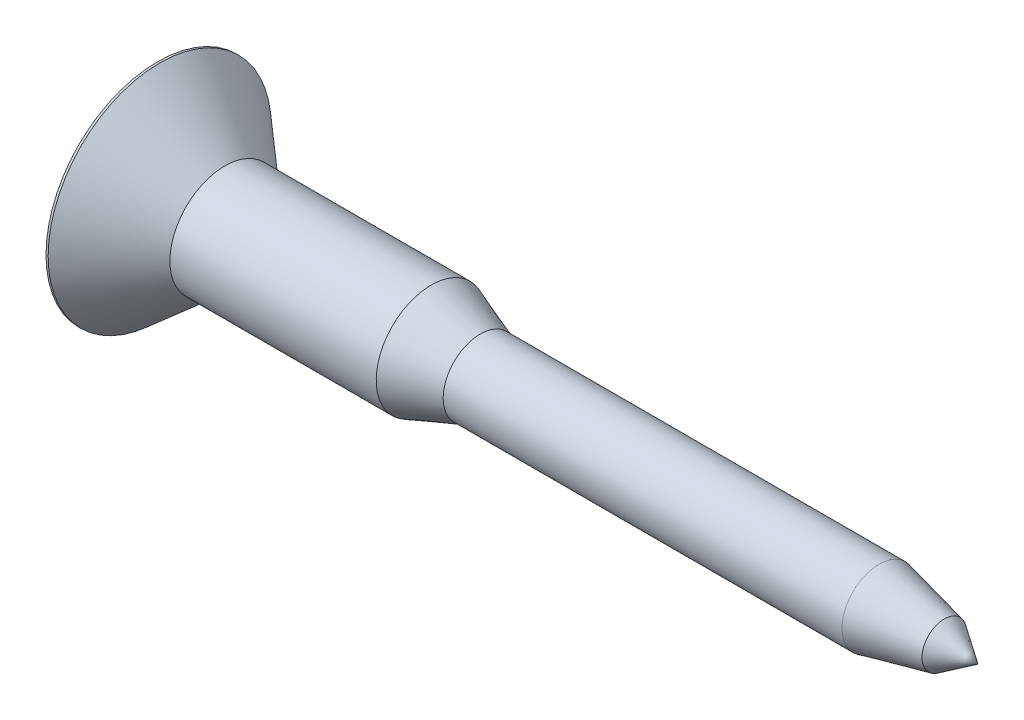
ISO-10303-21;
HEADER;
FILE_DESCRIPTION(('STEP AP214'),'2;1');
FILE_NAME('part.step','',(''),(''),'','','');
FILE_SCHEMA(('AUTOMOTIVE_DESIGN { 1 0 10303 214 1 1 1 1 }'));
ENDSEC;
DATA;
#1=APPLICATION_CONTEXT('core data for automotive mechanical design processes');
#2=APPLICATION_PROTOCOL_DEFINITION('international standard','automotive_design',2000,#1);
#3=PRODUCT_CONTEXT('',#1,'mechanical');
#4=PRODUCT('Part','Part','',(#3));
#5=PRODUCT_RELATED_PRODUCT_CATEGORY('part','',(#4));
#6=PRODUCT_DEFINITION_FORMATION('','',#4);
#7=PRODUCT_DEFINITION_CONTEXT('part definition',#1,'design');
#8=PRODUCT_DEFINITION('design','',#6,#7);
#9=PRODUCT_DEFINITION_SHAPE('','',#8);
#10=(LENGTH_UNIT() NAMED_UNIT(*) SI_UNIT(.MILLI.,.METRE.));
#11=(NAMED_UNIT(*) PLANE_ANGLE_UNIT() SI_UNIT($,.RADIAN.));
#12=(NAMED_UNIT(*) SI_UNIT($,.STERADIAN.) SOLID_ANGLE_UNIT());
#13=UNCERTAINTY_MEASURE_WITH_UNIT(LENGTH_MEASURE(1.E-05),#10,'distance_accuracy_value','');
#14=(GEOMETRIC_REPRESENTATION_CONTEXT(3) GLOBAL_UNCERTAINTY_ASSIGNED_CONTEXT((#13)) GLOBAL_UNIT_ASSIGNED_CONTEXT((#10,
#11,#12)) REPRESENTATION_CONTEXT('',''));
#15=CARTESIAN_POINT('',(0.,0.,0.));
#16=DIRECTION('',(0.,0.,1.));
#17=DIRECTION('',(1.,0.,0.));
#18=AXIS2_PLACEMENT_3D('',#15,#16,#17);
#19=CARTESIAN_POINT('',(-25.4,0.,0.));
#20=DIRECTION('',(1.,0.,0.));
#21=DIRECTION('',(0.,1.,0.));
#22=AXIS2_PLACEMENT_3D('',#19,#20,#21);
#23=PLANE('',#22);
#24=CARTESIAN_POINT('',(-25.4,0.,0.));
#25=DIRECTION('',(-1.,0.,0.));
#26=DIRECTION('',(0.,-1.,0.));
#27=AXIS2_PLACEMENT_3D('',#24,#25,#26);
#28=CIRCLE('',#27,6.9088);
#29=CARTESIAN_POINT('',(-25.4,-6.9088,0.));
#30=VERTEX_POINT('',#29);
#31=EDGE_CURVE('E346',#30,#30,#28,.T.);
#32=ORIENTED_EDGE('',*,*,#31,.T.);
#33=EDGE_LOOP('',(#32));
#34=FACE_BOUND('',#33,.T.);
#35=DIRECTION('',(0.,1.,0.));
#36=VECTOR('',#35,1.);
#37=CARTESIAN_POINT('',(-25.4,3.523488,-0.621792));
#38=LINE('',#37,#36);
#39=CARTESIAN_POINT('',(-25.4,1.64836786861186,-0.621792));
#40=VERTEX_POINT('',#39);
#41=CARTESIAN_POINT('',(-25.4,3.523488,-0.621792));
#42=VERTEX_POINT('',#41);
#43=EDGE_CURVE('E65',#40,#42,#38,.T.);
#44=ORIENTED_EDGE('',*,*,#43,.T.);
#45=DIRECTION('',(0.,0.,1.));
#46=VECTOR('',#45,1.);
#47=CARTESIAN_POINT('',(-25.4,3.523488,-0.621792));
#48=LINE('',#47,#46);
#49=CARTESIAN_POINT('',(-25.4,3.523488,0.621792));
#50=VERTEX_POINT('',#49);
#51=EDGE_CURVE('E761',#42,#50,#48,.T.);
#52=ORIENTED_EDGE('',*,*,#51,.T.);
#53=DIRECTION('',(0.,-1.,0.));
#54=VECTOR('',#53,1.);
#55=CARTESIAN_POINT('',(-25.4,3.523488,0.621792));
#56=LINE('',#55,#54);
#57=CARTESIAN_POINT('',(-25.4,1.64836786861186,0.621792));
#58=VERTEX_POINT('',#57);
#59=EDGE_CURVE('E765',#50,#58,#56,.T.);
#60=ORIENTED_EDGE('',*,*,#59,.T.);
#61=DIRECTION('',(0.,-0.916469532911304,0.400104480411474));
#62=VECTOR('',#61,1.);
#63=CARTESIAN_POINT('',(-25.4,0.933766564557356,0.933766564557357));
#64=LINE('',#63,#62);
#65=CARTESIAN_POINT('',(-25.4,0.933766564557356,0.933766564557357));
#66=VERTEX_POINT('',#65);
#67=EDGE_CURVE('E769',#58,#66,#64,.T.);
#68=ORIENTED_EDGE('',*,*,#67,.T.);
#69=DIRECTION('',(0.,-0.400104480411474,0.916469532911304));
#70=VECTOR('',#69,1.);
#71=CARTESIAN_POINT('',(-25.4,0.621792,1.64836786861186));
#72=LINE('',#71,#70);
#73=CARTESIAN_POINT('',(-25.4,0.621792,1.64836786861186));
#74=VERTEX_POINT('',#73);
#75=EDGE_CURVE('E773',#66,#74,#72,.T.);
#76=ORIENTED_EDGE('',*,*,#75,.T.);
#77=DIRECTION('',(0.,0.,1.));
#78=VECTOR('',#77,1.);
#79=CARTESIAN_POINT('',(-25.4,0.621792,1.64836786861186));
#80=LINE('',#79,#78);
#81=CARTESIAN_POINT('',(-25.4,0.621792,3.523488));
#82=VERTEX_POINT('',#81);
#83=EDGE_CURVE('E718',#74,#82,#80,.T.);
#84=ORIENTED_EDGE('',*,*,#83,.T.);
#85=DIRECTION('',(0.,-1.,0.));
#86=VECTOR('',#85,1.);
#87=CARTESIAN_POINT('',(-25.4,0.621792,3.523488));
#88=LINE('',#87,#86);
#89=CARTESIAN_POINT('',(-25.4,-0.621792,3.523488));
#90=VERTEX_POINT('',#89);
#91=EDGE_CURVE('E714',#82,#90,#88,.T.);
#92=ORIENTED_EDGE('',*,*,#91,.T.);
#93=DIRECTION('',(0.,0.,-1.));
#94=VECTOR('',#93,1.);
#95=CARTESIAN_POINT('',(-25.4,-0.621792,1.64836786861186));
#96=LINE('',#95,#94);
#97=CARTESIAN_POINT('',(-25.4,-0.621792,1.64836786861186));
#98=VERTEX_POINT('',#97);
#99=EDGE_CURVE('E780',#90,#98,#96,.T.);
#100=ORIENTED_EDGE('',*,*,#99,.T.);
#101=DIRECTION('',(0.,-0.400104480411474,-0.916469532911304));
#102=VECTOR('',#101,1.);
#103=CARTESIAN_POINT('',(-25.4,-0.621792,1.64836786861186));
#104=LINE('',#103,#102);
#105=CARTESIAN_POINT('',(-25.4,-0.933766564557356,0.933766564557357));
#106=VERTEX_POINT('',#105);
#107=EDGE_CURVE('E784',#98,#106,#104,.T.);
#108=ORIENTED_EDGE('',*,*,#107,.T.);
#109=DIRECTION('',(0.,-0.916469532911304,-0.400104480411474));
#110=VECTOR('',#109,1.);
#111=CARTESIAN_POINT('',(-25.4,-0.933766564557356,0.933766564557357));
#112=LINE('',#111,#110);
#113=CARTESIAN_POINT('',(-25.4,-1.64836786861186,0.621792));
#114=VERTEX_POINT('',#113);
#115=EDGE_CURVE('E788',#106,#114,#112,.T.);
#116=ORIENTED_EDGE('',*,*,#115,.T.);
#117=DIRECTION('',(0.,-1.,0.));
#118=VECTOR('',#117,1.);
#119=CARTESIAN_POINT('',(-25.4,-1.64836786861186,0.621792));
#120=LINE('',#119,#118);
#121=CARTESIAN_POINT('',(-25.4,-3.523488,0.621792));
#122=VERTEX_POINT('',#121);
#123=EDGE_CURVE('E792',#114,#122,#120,.T.);
#124=ORIENTED_EDGE('',*,*,#123,.T.);
#125=DIRECTION('',(0.,0.,-1.));
#126=VECTOR('',#125,1.);
#127=CARTESIAN_POINT('',(-25.4,-3.523488,-0.621792));
#128=LINE('',#127,#126);
#129=CARTESIAN_POINT('',(-25.4,-3.523488,-0.621792));
#130=VERTEX_POINT('',#129);
#131=EDGE_CURVE('E796',#122,#130,#128,.T.);
#132=ORIENTED_EDGE('',*,*,#131,.T.);
#133=DIRECTION('',(0.,1.,0.));
#134=VECTOR('',#133,1.);
#135=CARTESIAN_POINT('',(-25.4,-1.64836786861186,-0.621792));
#136=LINE('',#135,#134);
#137=CARTESIAN_POINT('',(-25.4,-1.64836786861186,-0.621792));
#138=VERTEX_POINT('',#137);
#139=EDGE_CURVE('E800',#130,#138,#136,.T.);
#140=ORIENTED_EDGE('',*,*,#139,.T.);
#141=DIRECTION('',(0.,0.916469532911304,-0.400104480411474));
#142=VECTOR('',#141,1.);
#143=CARTESIAN_POINT('',(-25.4,-0.933766564557356,-0.933766564557357));
#144=LINE('',#143,#142);
#145=CARTESIAN_POINT('',(-25.4,-0.933766564557356,-0.933766564557357));
#146=VERTEX_POINT('',#145);
#147=EDGE_CURVE('E804',#138,#146,#144,.T.);
#148=ORIENTED_EDGE('',*,*,#147,.T.);
#149=DIRECTION('',(0.,0.400104480411474,-0.916469532911304));
#150=VECTOR('',#149,1.);
#151=CARTESIAN_POINT('',(-25.4,-0.621792,-1.64836786861186));
#152=LINE('',#151,#150);
#153=CARTESIAN_POINT('',(-25.4,-0.621792,-1.64836786861186));
#154=VERTEX_POINT('',#153);
#155=EDGE_CURVE('E808',#146,#154,#152,.T.);
#156=ORIENTED_EDGE('',*,*,#155,.T.);
#157=DIRECTION('',(0.,0.,-1.));
#158=VECTOR('',#157,1.);
#159=CARTESIAN_POINT('',(-25.4,-0.621792,-3.523488));
#160=LINE('',#159,#158);
#161=CARTESIAN_POINT('',(-25.4,-0.621792,-3.523488));
#162=VERTEX_POINT('',#161);
#163=EDGE_CURVE('E812',#154,#162,#160,.T.);
#164=ORIENTED_EDGE('',*,*,#163,.T.);
#165=DIRECTION('',(0.,1.,0.));
#166=VECTOR('',#165,1.);
#167=CARTESIAN_POINT('',(-25.4,0.621792,-3.523488));
#168=LINE('',#167,#166);
#169=CARTESIAN_POINT('',(-25.4,0.621792,-3.523488));
#170=VERTEX_POINT('',#169);
#171=EDGE_CURVE('E238',#162,#170,#168,.T.);
#172=ORIENTED_EDGE('',*,*,#171,.T.);
#173=DIRECTION('',(0.,0.,1.));
#174=VECTOR('',#173,1.);
#175=CARTESIAN_POINT('',(-25.4,0.621792,-3.523488));
#176=LINE('',#175,#174);
#177=CARTESIAN_POINT('',(-25.4,0.621792,-1.64836786861186));
#178=VERTEX_POINT('',#177);
#179=EDGE_CURVE('E817',#170,#178,#176,.T.);
#180=ORIENTED_EDGE('',*,*,#179,.T.);
#181=DIRECTION('',(0.,0.400104480411474,0.916469532911304));
#182=VECTOR('',#181,1.);
#183=CARTESIAN_POINT('',(-25.4,0.621792,-1.64836786861186));
#184=LINE('',#183,#182);
#185=CARTESIAN_POINT('',(-25.4,0.933766564557356,-0.933766564557357));
#186=VERTEX_POINT('',#185);
#187=EDGE_CURVE('E821',#178,#186,#184,.T.);
#188=ORIENTED_EDGE('',*,*,#187,.T.);
#189=DIRECTION('',(0.,0.916469532911304,0.400104480411474));
#190=VECTOR('',#189,1.);
#191=CARTESIAN_POINT('',(-25.4,0.933766564557356,-0.933766564557357));
#192=LINE('',#191,#190);
#193=EDGE_CURVE('E743',#186,#40,#192,.T.);
#194=ORIENTED_EDGE('',*,*,#193,.T.);
#195=EDGE_LOOP('',(#44,#52,#60,#68,#76,#84,#92,#100,#108,#116,#124,#132,#140,#148,#156,#164,
#172,#180,#188,#194));
#196=FACE_BOUND('',#195,.T.);
#197=ADVANCED_FACE('F49',(#34,#196),#23,.F.);
#198=CARTESIAN_POINT('',(25.4,0.,0.));
#199=DIRECTION('',(-1.,0.,0.));
#200=DIRECTION('',(0.,-1.,0.));
#201=AXIS2_PLACEMENT_3D('',#198,#199,#200);
#202=CONICAL_SURFACE('',#201,0.,0.584846577464638);
#203=CARTESIAN_POINT('',(23.3120667413867,0.,0.));
#204=DIRECTION('',(-1.,0.,0.));
#205=DIRECTION('',(0.,-1.,0.));
#206=AXIS2_PLACEMENT_3D('',#203,#204,#205);
#207=CIRCLE('',#206,1.38245718841912);
#208=CARTESIAN_POINT('',(23.3120667413867,-1.38245718841912,0.));
#209=VERTEX_POINT('',#208);
#210=EDGE_CURVE('E11',#209,#209,#207,.T.);
#211=ORIENTED_EDGE('',*,*,#210,.F.);
#212=EDGE_LOOP('',(#211));
#213=FACE_BOUND('',#212,.T.);
#214=CARTESIAN_POINT('',(25.4,0.,0.));
#215=VERTEX_POINT('',#214);
#216=VERTEX_LOOP('',#215);
#217=FACE_BOUND('',#216,.T.);
#218=ADVANCED_FACE('F51',(#213,#217),#202,.T.);
#219=CARTESIAN_POINT('',(23.3120667413867,0.,0.));
#220=DIRECTION('',(-1.,0.,0.));
#221=DIRECTION('',(0.,-1.,0.));
#222=AXIS2_PLACEMENT_3D('',#219,#220,#221);
#223=CONICAL_SURFACE('',#222,1.38245718841912,0.222798696177006);
#224=CARTESIAN_POINT('',(19.27352,0.,0.));
#225=DIRECTION('',(-1.,0.,0.));
#226=DIRECTION('',(0.,-1.,0.));
#227=AXIS2_PLACEMENT_3D('',#224,#225,#226);
#228=CIRCLE('',#227,2.29742999999999);
#229=CARTESIAN_POINT('',(19.27352,-2.29742999999999,0.));
#230=VERTEX_POINT('',#229);
#231=EDGE_CURVE('E58',#230,#230,#228,.T.);
#232=ORIENTED_EDGE('',*,*,#231,.F.);
#233=EDGE_LOOP('',(#232));
#234=FACE_BOUND('',#233,.T.);
#235=ORIENTED_EDGE('',*,*,#210,.T.);
#236=EDGE_LOOP('',(#235));
#237=FACE_BOUND('',#236,.T.);
#238=ADVANCED_FACE('F371',(#234,#237),#223,.T.);
#239=CARTESIAN_POINT('',(-25.4,0.,0.));
#240=DIRECTION('',(-1.,0.,0.));
#241=DIRECTION('',(0.,-1.,0.));
#242=AXIS2_PLACEMENT_3D('',#239,#240,#241);
#243=CYLINDRICAL_SURFACE('',#242,2.29742999999999);
#244=CARTESIAN_POINT('',(-5.41902290292186,0.,0.));
#245=DIRECTION('',(-1.,0.,0.));
#246=DIRECTION('',(0.,-1.,0.));
#247=AXIS2_PLACEMENT_3D('',#244,#245,#246);
#248=CIRCLE('',#247,2.29742999999999);
#249=CARTESIAN_POINT('',(-5.41902290292186,-2.29742999999999,0.));
#250=VERTEX_POINT('',#249);
#251=EDGE_CURVE('E362',#250,#250,#248,.T.);
#252=ORIENTED_EDGE('',*,*,#251,.F.);
#253=EDGE_LOOP('',(#252));
#254=FACE_BOUND('',#253,.T.);
#255=ORIENTED_EDGE('',*,*,#231,.T.);
#256=EDGE_LOOP('',(#255));
#257=FACE_BOUND('',#256,.T.);
#258=ADVANCED_FACE('F369',(#254,#257),#243,.T.);
#259=CARTESIAN_POINT('',(-5.41902290292186,0.,0.));
#260=DIRECTION('',(-1.,0.,0.));
#261=DIRECTION('',(0.,-1.,0.));
#262=AXIS2_PLACEMENT_3D('',#259,#260,#261);
#263=CONICAL_SURFACE('',#262,2.29742999999999,0.349065850398867);
#264=CARTESIAN_POINT('',(-8.4582,0.,0.));
#265=DIRECTION('',(-1.,0.,0.));
#266=DIRECTION('',(0.,-1.,0.));
#267=AXIS2_PLACEMENT_3D('',#264,#265,#266);
#268=CIRCLE('',#267,3.4036);
#269=CARTESIAN_POINT('',(-8.4582,-3.4036,0.));
#270=VERTEX_POINT('',#269);
#271=EDGE_CURVE('E358',#270,#270,#268,.T.);
#272=ORIENTED_EDGE('',*,*,#271,.F.);
#273=EDGE_LOOP('',(#272));
#274=FACE_BOUND('',#273,.T.);
#275=ORIENTED_EDGE('',*,*,#251,.T.);
#276=EDGE_LOOP('',(#275));
#277=FACE_BOUND('',#276,.T.);
#278=ADVANCED_FACE('F402',(#274,#277),#263,.T.);
#279=CARTESIAN_POINT('',(-25.4,0.,0.));
#280=DIRECTION('',(-1.,0.,0.));
#281=DIRECTION('',(0.,-1.,0.));
#282=AXIS2_PLACEMENT_3D('',#279,#280,#281);
#283=CYLINDRICAL_SURFACE('',#282,3.4036);
#284=CARTESIAN_POINT('',(-21.2344,0.,0.));
#285=DIRECTION('',(-1.,0.,0.));
#286=DIRECTION('',(0.,-1.,0.));
#287=AXIS2_PLACEMENT_3D('',#284,#285,#286);
#288=CIRCLE('',#287,3.4036);
#289=CARTESIAN_POINT('',(-21.2344,-3.4036,0.));
#290=VERTEX_POINT('',#289);
#291=EDGE_CURVE('E354',#290,#290,#288,.T.);
#292=ORIENTED_EDGE('',*,*,#291,.F.);
#293=EDGE_LOOP('',(#292));
#294=FACE_BOUND('',#293,.T.);
#295=ORIENTED_EDGE('',*,*,#271,.T.);
#296=EDGE_LOOP('',(#295));
#297=FACE_BOUND('',#296,.T.);
#298=ADVANCED_FACE('F398',(#294,#297),#283,.T.);
#299=CARTESIAN_POINT('',(-21.2344,0.,0.));
#300=DIRECTION('',(-1.,0.,0.));
#301=DIRECTION('',(0.,-1.,0.));
#302=AXIS2_PLACEMENT_3D('',#299,#300,#301);
#303=CONICAL_SURFACE('',#302,3.4036,0.715584993317675);
#304=CARTESIAN_POINT('',(-25.2666713409911,0.,0.));
#305=DIRECTION('',(-1.,0.,0.));
#306=DIRECTION('',(0.,-1.,0.));
#307=AXIS2_PLACEMENT_3D('',#304,#305,#306);
#308=CIRCLE('',#307,6.9088);
#309=CARTESIAN_POINT('',(-25.2666713409911,-6.9088,0.));
#310=VERTEX_POINT('',#309);
#311=EDGE_CURVE('E350',#310,#310,#308,.T.);
#312=ORIENTED_EDGE('',*,*,#311,.F.);
#313=EDGE_LOOP('',(#312));
#314=FACE_BOUND('',#313,.T.);
#315=ORIENTED_EDGE('',*,*,#291,.T.);
#316=EDGE_LOOP('',(#315));
#317=FACE_BOUND('',#316,.T.);
#318=ADVANCED_FACE('F394',(#314,#317),#303,.T.);
#319=CARTESIAN_POINT('',(-25.4,0.,0.));
#320=DIRECTION('',(-1.,0.,0.));
#321=DIRECTION('',(0.,-1.,0.));
#322=AXIS2_PLACEMENT_3D('',#319,#320,#321);
#323=CYLINDRICAL_SURFACE('',#322,6.9088);
#324=ORIENTED_EDGE('',*,*,#31,.F.);
#325=EDGE_LOOP('',(#324));
#326=FACE_BOUND('',#325,.T.);
#327=ORIENTED_EDGE('',*,*,#311,.T.);
#328=EDGE_LOOP('',(#327));
#329=FACE_BOUND('',#328,.T.);
#330=ADVANCED_FACE('F390',(#326,#329),#323,.T.);
#331=CARTESIAN_POINT('',(-22.2758,3.523488,-0.621792));
#332=DIRECTION('',(0.,0.,1.));
#333=DIRECTION('',(1.,0.,0.));
#334=AXIS2_PLACEMENT_3D('',#331,#332,#333);
#335=PLANE('',#334);
#336=DIRECTION('',(-1.,0.,0.));
#337=VECTOR('',#336,1.);
#338=CARTESIAN_POINT('',(-22.2758,3.523488,-0.621792));
#339=LINE('',#338,#337);
#340=CARTESIAN_POINT('',(-24.96566,3.523488,-0.621792));
#341=VERTEX_POINT('',#340);
#342=EDGE_CURVE('E271',#341,#42,#339,.T.);
#343=ORIENTED_EDGE('',*,*,#342,.T.);
#344=ORIENTED_EDGE('',*,*,#43,.F.);
#345=DIRECTION('',(0.991530266883328,-0.129875824749165,0.));
#346=VECTOR('',#345,1.);
#347=CARTESIAN_POINT('',(-25.3079766374035,1.63631416686155,-0.621792));
#348=LINE('',#347,#346);
#349=CARTESIAN_POINT('',(-22.2758,1.2391437982698,-0.621792));
#350=VERTEX_POINT('',#349);
#351=EDGE_CURVE('E324',#350,#40,#348,.F.);
#352=ORIENTED_EDGE('',*,*,#351,.F.);
#353=DIRECTION('',(0.,1.,0.));
#354=VECTOR('',#353,1.);
#355=CARTESIAN_POINT('',(-22.2758,3.523488,-0.621792));
#356=LINE('',#355,#354);
#357=CARTESIAN_POINT('',(-22.2758,1.90725705530253,-0.621792));
#358=VERTEX_POINT('',#357);
#359=EDGE_CURVE('E739',#350,#358,#356,.T.);
#360=ORIENTED_EDGE('',*,*,#359,.T.);
#361=DIRECTION('',(0.857167300702113,-0.515038074910053,0.));
#362=VECTOR('',#361,1.);
#363=CARTESIAN_POINT('',(-22.9893236110624,2.33598529393624,-0.621792));
#364=LINE('',#363,#362);
#365=EDGE_CURVE('E735',#341,#358,#364,.T.);
#366=ORIENTED_EDGE('',*,*,#365,.F.);
#367=EDGE_LOOP('',(#343,#344,#352,#360,#366));
#368=FACE_BOUND('',#367,.T.);
#369=ADVANCED_FACE('F393',(#368),#335,.T.);
#370=CARTESIAN_POINT('',(-22.2758,3.523488,-0.621792));
#371=DIRECTION('',(0.,-1.,0.));
#372=DIRECTION('',(0.,0.,-1.));
#373=AXIS2_PLACEMENT_3D('',#370,#371,#372);
#374=PLANE('',#373);
#375=DIRECTION('',(-1.,0.,0.));
#376=VECTOR('',#375,1.);
#377=CARTESIAN_POINT('',(-22.2758,3.523488,0.621792));
#378=LINE('',#377,#376);
#379=CARTESIAN_POINT('',(-24.96566,3.523488,0.621792));
#380=VERTEX_POINT('',#379);
#381=EDGE_CURVE('E268',#380,#50,#378,.T.);
#382=ORIENTED_EDGE('',*,*,#381,.T.);
#383=ORIENTED_EDGE('',*,*,#51,.F.);
#384=ORIENTED_EDGE('',*,*,#342,.F.);
#385=DIRECTION('',(0.,0.,1.));
#386=VECTOR('',#385,1.);
#387=CARTESIAN_POINT('',(-24.96566,3.523488,-6.9088));
#388=LINE('',#387,#386);
#389=EDGE_CURVE('E722',#341,#380,#388,.T.);
#390=ORIENTED_EDGE('',*,*,#389,.T.);
#391=EDGE_LOOP('',(#382,#383,#384,#390));
#392=FACE_BOUND('',#391,.T.);
#393=ADVANCED_FACE('F444',(#392),#374,.T.);
#394=CARTESIAN_POINT('',(-22.2758,3.523488,0.621792));
#395=DIRECTION('',(0.,0.,-1.));
#396=DIRECTION('',(-1.,0.,0.));
#397=AXIS2_PLACEMENT_3D('',#394,#395,#396);
#398=PLANE('',#397);
#399=DIRECTION('',(0.,-1.,0.));
#400=VECTOR('',#399,1.);
#401=CARTESIAN_POINT('',(-22.2758,3.523488,0.621792));
#402=LINE('',#401,#400);
#403=CARTESIAN_POINT('',(-22.2758,1.90725705530253,0.621792));
#404=VERTEX_POINT('',#403);
#405=CARTESIAN_POINT('',(-22.2758,1.2391437982698,0.621792));
#406=VERTEX_POINT('',#405);
#407=EDGE_CURVE('E289',#404,#406,#402,.T.);
#408=ORIENTED_EDGE('',*,*,#407,.T.);
#409=DIRECTION('',(0.991530266883328,-0.129875824749165,0.));
#410=VECTOR('',#409,1.);
#411=CARTESIAN_POINT('',(-22.5699682775812,1.27767549915877,0.621792));
#412=LINE('',#411,#410);
#413=EDGE_CURVE('E272',#406,#58,#412,.F.);
#414=ORIENTED_EDGE('',*,*,#413,.T.);
#415=ORIENTED_EDGE('',*,*,#59,.F.);
#416=ORIENTED_EDGE('',*,*,#381,.F.);
#417=DIRECTION('',(-0.857167300702113,0.515038074910053,0.));
#418=VECTOR('',#417,1.);
#419=CARTESIAN_POINT('',(-22.9893236110624,2.33598529393624,0.621792));
#420=LINE('',#419,#418);
#421=EDGE_CURVE('E726',#404,#380,#420,.T.);
#422=ORIENTED_EDGE('',*,*,#421,.F.);
#423=EDGE_LOOP('',(#408,#414,#415,#416,#422));
#424=FACE_BOUND('',#423,.T.);
#425=ADVANCED_FACE('F454',(#424),#398,.T.);
#426=CARTESIAN_POINT('',(-25.4,0.933766564557356,0.933766564557357));
#427=DIRECTION('',(0.052335956242944,0.399556151126531,0.915213543267957));
#428=DIRECTION('',(0.,-0.916469532911304,0.400104480411474));
#429=AXIS2_PLACEMENT_3D('',#426,#427,#428);
#430=PLANE('',#429);
#431=ORIENTED_EDGE('',*,*,#67,.F.);
#432=ORIENTED_EDGE('',*,*,#413,.F.);
#433=DIRECTION('',(0.,0.916469532911304,-0.400104480411474));
#434=VECTOR('',#433,1.);
#435=CARTESIAN_POINT('',(-22.2758,0.426367502296385,0.976626968226574));
#436=LINE('',#435,#434);
#437=CARTESIAN_POINT('',(-22.2758,0.809404103822734,0.809404103822735));
#438=VERTEX_POINT('',#437);
#439=EDGE_CURVE('E285',#406,#438,#436,.F.);
#440=ORIENTED_EDGE('',*,*,#439,.T.);
#441=DIRECTION('',(-0.998419224400763,0.0397432531820087,0.0397432531820087));
#442=VECTOR('',#441,1.);
#443=CARTESIAN_POINT('',(-25.4,0.933766564557356,0.933766564557357));
#444=LINE('',#443,#442);
#445=EDGE_CURVE('E280',#438,#66,#444,.T.);
#446=ORIENTED_EDGE('',*,*,#445,.T.);
#447=EDGE_LOOP('',(#431,#432,#440,#446));
#448=FACE_BOUND('',#447,.T.);
#449=ADVANCED_FACE('F465',(#448),#430,.F.);
#450=CARTESIAN_POINT('',(-25.4,0.621792,1.64836786861186));
#451=DIRECTION('',(0.052335956242944,0.915213543267957,0.399556151126531));
#452=DIRECTION('',(0.,-0.400104480411474,0.916469532911304));
#453=AXIS2_PLACEMENT_3D('',#450,#451,#452);
#454=PLANE('',#453);
#455=ORIENTED_EDGE('',*,*,#75,.F.);
#456=ORIENTED_EDGE('',*,*,#445,.F.);
#457=DIRECTION('',(0.,0.400104480411474,-0.916469532911304));
#458=VECTOR('',#457,1.);
#459=CARTESIAN_POINT('',(-22.2758,0.976626968226574,0.426367502296384));
#460=LINE('',#459,#458);
#461=CARTESIAN_POINT('',(-22.2758,0.621792,1.2391437982698));
#462=VERTEX_POINT('',#461);
#463=EDGE_CURVE('E288',#438,#462,#460,.F.);
#464=ORIENTED_EDGE('',*,*,#463,.T.);
#465=DIRECTION('',(0.991530266883328,0.,-0.129875824749165));
#466=VECTOR('',#465,1.);
#467=CARTESIAN_POINT('',(-25.4,0.621792,1.64836786861186));
#468=LINE('',#467,#466);
#469=EDGE_CURVE('E267',#462,#74,#468,.F.);
#470=ORIENTED_EDGE('',*,*,#469,.T.);
#471=EDGE_LOOP('',(#455,#456,#464,#470));
#472=FACE_BOUND('',#471,.T.);
#473=ADVANCED_FACE('F476',(#472),#454,.F.);
#474=CARTESIAN_POINT('',(-22.2758,0.621792,1.64836786861186));
#475=DIRECTION('',(0.,-1.,0.));
#476=DIRECTION('',(0.,0.,-1.));
#477=AXIS2_PLACEMENT_3D('',#474,#475,#476);
#478=PLANE('',#477);
#479=DIRECTION('',(-1.,0.,0.));
#480=VECTOR('',#479,1.);
#481=CARTESIAN_POINT('',(-22.2758,0.621792,3.523488));
#482=LINE('',#481,#480);
#483=CARTESIAN_POINT('',(-24.96566,0.621792,3.523488));
#484=VERTEX_POINT('',#483);
#485=EDGE_CURVE('E263',#484,#82,#482,.T.);
#486=ORIENTED_EDGE('',*,*,#485,.T.);
#487=ORIENTED_EDGE('',*,*,#83,.F.);
#488=ORIENTED_EDGE('',*,*,#469,.F.);
#489=DIRECTION('',(0.,0.,1.));
#490=VECTOR('',#489,1.);
#491=CARTESIAN_POINT('',(-22.2758,0.621792,1.64836786861186));
#492=LINE('',#491,#490);
#493=CARTESIAN_POINT('',(-22.2758,0.621792,1.90725705530253));
#494=VERTEX_POINT('',#493);
#495=EDGE_CURVE('E292',#462,#494,#492,.T.);
#496=ORIENTED_EDGE('',*,*,#495,.T.);
#497=DIRECTION('',(0.857167300702113,0.,-0.515038074910053));
#498=VECTOR('',#497,1.);
#499=CARTESIAN_POINT('',(-22.1615072078971,0.621792,1.83858301748921));
#500=LINE('',#499,#498);
#501=EDGE_CURVE('E706',#484,#494,#500,.T.);
#502=ORIENTED_EDGE('',*,*,#501,.F.);
#503=EDGE_LOOP('',(#486,#487,#488,#496,#502));
#504=FACE_BOUND('',#503,.T.);
#505=ADVANCED_FACE('F487',(#504),#478,.T.);
#506=CARTESIAN_POINT('',(-22.2758,0.621792,3.523488));
#507=DIRECTION('',(0.,0.,-1.));
#508=DIRECTION('',(-1.,0.,0.));
#509=AXIS2_PLACEMENT_3D('',#506,#507,#508);
#510=PLANE('',#509);
#511=DIRECTION('',(-1.,0.,0.));
#512=VECTOR('',#511,1.);
#513=CARTESIAN_POINT('',(-22.2758,-0.621792,3.523488));
#514=LINE('',#513,#512);
#515=CARTESIAN_POINT('',(-24.96566,-0.621792,3.523488));
#516=VERTEX_POINT('',#515);
#517=EDGE_CURVE('E260',#516,#90,#514,.T.);
#518=ORIENTED_EDGE('',*,*,#517,.T.);
#519=ORIENTED_EDGE('',*,*,#91,.F.);
#520=ORIENTED_EDGE('',*,*,#485,.F.);
#521=DIRECTION('',(0.,-1.,0.));
#522=VECTOR('',#521,1.);
#523=CARTESIAN_POINT('',(-24.96566,3.523488,3.52348800000001));
#524=LINE('',#523,#522);
#525=EDGE_CURVE('E704',#484,#516,#524,.T.);
#526=ORIENTED_EDGE('',*,*,#525,.T.);
#527=EDGE_LOOP('',(#518,#519,#520,#526));
#528=FACE_BOUND('',#527,.T.);
#529=ADVANCED_FACE('F498',(#528),#510,.T.);
#530=CARTESIAN_POINT('',(-22.2758,-0.621792,1.64836786861186));
#531=DIRECTION('',(0.,1.,0.));
#532=DIRECTION('',(0.,0.,1.));
#533=AXIS2_PLACEMENT_3D('',#530,#531,#532);
#534=PLANE('',#533);
#535=DIRECTION('',(0.,0.,-1.));
#536=VECTOR('',#535,1.);
#537=CARTESIAN_POINT('',(-22.2758,-0.621792,1.64836786861186));
#538=LINE('',#537,#536);
#539=CARTESIAN_POINT('',(-22.2758,-0.621792,1.90725705530253));
#540=VERTEX_POINT('',#539);
#541=CARTESIAN_POINT('',(-22.2758,-0.621792,1.2391437982698));
#542=VERTEX_POINT('',#541);
#543=EDGE_CURVE('E304',#540,#542,#538,.T.);
#544=ORIENTED_EDGE('',*,*,#543,.T.);
#545=DIRECTION('',(0.991530266883328,0.,-0.129875824749165));
#546=VECTOR('',#545,1.);
#547=CARTESIAN_POINT('',(-22.3284981616107,-0.621792,1.2460464793382));
#548=LINE('',#547,#546);
#549=EDGE_CURVE('E264',#542,#98,#548,.F.);
#550=ORIENTED_EDGE('',*,*,#549,.T.);
#551=ORIENTED_EDGE('',*,*,#99,.F.);
#552=ORIENTED_EDGE('',*,*,#517,.F.);
#553=DIRECTION('',(-0.857167300702113,0.,0.515038074910053));
#554=VECTOR('',#553,1.);
#555=CARTESIAN_POINT('',(-22.1615072078971,-0.621792,1.83858301748921));
#556=LINE('',#555,#554);
#557=EDGE_CURVE('E708',#540,#516,#556,.T.);
#558=ORIENTED_EDGE('',*,*,#557,.F.);
#559=EDGE_LOOP('',(#544,#550,#551,#552,#558));
#560=FACE_BOUND('',#559,.T.);
#561=ADVANCED_FACE('F509',(#560),#534,.T.);
#562=CARTESIAN_POINT('',(-25.4,-0.621792,1.64836786861186));
#563=DIRECTION('',(0.052335956242944,-0.915213543267957,0.399556151126531));
#564=DIRECTION('',(0.,-0.400104480411474,-0.916469532911304));
#565=AXIS2_PLACEMENT_3D('',#562,#563,#564);
#566=PLANE('',#565);
#567=ORIENTED_EDGE('',*,*,#107,.F.);
#568=ORIENTED_EDGE('',*,*,#549,.F.);
#569=DIRECTION('',(0.,0.400104480411474,0.916469532911304));
#570=VECTOR('',#569,1.);
#571=CARTESIAN_POINT('',(-22.2758,-0.976626968226574,0.426367502296384));
#572=LINE('',#571,#570);
#573=CARTESIAN_POINT('',(-22.2758,-0.809404103822734,0.809404103822735));
#574=VERTEX_POINT('',#573);
#575=EDGE_CURVE('E300',#542,#574,#572,.F.);
#576=ORIENTED_EDGE('',*,*,#575,.T.);
#577=DIRECTION('',(-0.998419224400763,-0.0397432531820087,0.0397432531820087));
#578=VECTOR('',#577,1.);
#579=CARTESIAN_POINT('',(-25.4159764013544,-0.934402524030539,0.934402524030539));
#580=LINE('',#579,#578);
#581=EDGE_CURVE('E295',#574,#106,#580,.T.);
#582=ORIENTED_EDGE('',*,*,#581,.T.);
#583=EDGE_LOOP('',(#567,#568,#576,#582));
#584=FACE_BOUND('',#583,.T.);
#585=ADVANCED_FACE('F520',(#584),#566,.F.);
#586=CARTESIAN_POINT('',(-25.4,-0.933766564557356,0.933766564557357));
#587=DIRECTION('',(0.052335956242944,-0.399556151126531,0.915213543267957));
#588=DIRECTION('',(0.,-0.916469532911304,-0.400104480411474));
#589=AXIS2_PLACEMENT_3D('',#586,#587,#588);
#590=PLANE('',#589);
#591=ORIENTED_EDGE('',*,*,#115,.F.);
#592=ORIENTED_EDGE('',*,*,#581,.F.);
#593=DIRECTION('',(0.,0.916469532911304,0.400104480411474));
#594=VECTOR('',#593,1.);
#595=CARTESIAN_POINT('',(-22.2758,-0.426367502296385,0.976626968226574));
#596=LINE('',#595,#594);
#597=CARTESIAN_POINT('',(-22.2758,-1.2391437982698,0.621792));
#598=VERTEX_POINT('',#597);
#599=EDGE_CURVE('E303',#574,#598,#596,.F.);
#600=ORIENTED_EDGE('',*,*,#599,.T.);
#601=DIRECTION('',(0.991530266883328,0.129875824749165,0.));
#602=VECTOR('',#601,1.);
#603=CARTESIAN_POINT('',(-25.3079766374035,-1.63631416686155,0.621792));
#604=LINE('',#603,#602);
#605=EDGE_CURVE('E259',#598,#114,#604,.F.);
#606=ORIENTED_EDGE('',*,*,#605,.T.);
#607=EDGE_LOOP('',(#591,#592,#600,#606));
#608=FACE_BOUND('',#607,.T.);
#609=ADVANCED_FACE('F388',(#608),#590,.F.);
#610=CARTESIAN_POINT('',(-22.2758,-1.64836786861186,0.621792));
#611=DIRECTION('',(0.,0.,-1.));
#612=DIRECTION('',(-1.,0.,0.));
#613=AXIS2_PLACEMENT_3D('',#610,#611,#612);
#614=PLANE('',#613);
#615=DIRECTION('',(-1.,0.,0.));
#616=VECTOR('',#615,1.);
#617=CARTESIAN_POINT('',(-22.2758,-3.523488,0.621792));
#618=LINE('',#617,#616);
#619=CARTESIAN_POINT('',(-24.96566,-3.523488,0.621792));
#620=VERTEX_POINT('',#619);
#621=EDGE_CURVE('E255',#620,#122,#618,.T.);
#622=ORIENTED_EDGE('',*,*,#621,.T.);
#623=ORIENTED_EDGE('',*,*,#123,.F.);
#624=ORIENTED_EDGE('',*,*,#605,.F.);
#625=DIRECTION('',(0.,-1.,0.));
#626=VECTOR('',#625,1.);
#627=CARTESIAN_POINT('',(-22.2758,-1.64836786861186,0.621792));
#628=LINE('',#627,#626);
#629=CARTESIAN_POINT('',(-22.2758,-1.90725705530253,0.621792));
#630=VERTEX_POINT('',#629);
#631=EDGE_CURVE('E307',#598,#630,#628,.T.);
#632=ORIENTED_EDGE('',*,*,#631,.T.);
#633=DIRECTION('',(0.857167300702113,0.515038074910053,0.));
#634=VECTOR('',#633,1.);
#635=CARTESIAN_POINT('',(-22.1615072078971,-1.83858301748921,0.621792));
#636=LINE('',#635,#634);
#637=EDGE_CURVE('E728',#620,#630,#636,.T.);
#638=ORIENTED_EDGE('',*,*,#637,.F.);
#639=EDGE_LOOP('',(#622,#623,#624,#632,#638));
#640=FACE_BOUND('',#639,.T.);
#641=ADVANCED_FACE('F540',(#640),#614,.T.);
#642=CARTESIAN_POINT('',(-22.2758,-3.523488,-0.621792));
#643=DIRECTION('',(0.,1.,0.));
#644=DIRECTION('',(0.,0.,1.));
#645=AXIS2_PLACEMENT_3D('',#642,#643,#644);
#646=PLANE('',#645);
#647=DIRECTION('',(-1.,0.,0.));
#648=VECTOR('',#647,1.);
#649=CARTESIAN_POINT('',(-22.2758,-3.523488,-0.621792));
#650=LINE('',#649,#648);
#651=CARTESIAN_POINT('',(-24.96566,-3.523488,-0.621792));
#652=VERTEX_POINT('',#651);
#653=EDGE_CURVE('E252',#652,#130,#650,.T.);
#654=ORIENTED_EDGE('',*,*,#653,.T.);
#655=ORIENTED_EDGE('',*,*,#131,.F.);
#656=ORIENTED_EDGE('',*,*,#621,.F.);
#657=DIRECTION('',(0.,0.,-1.));
#658=VECTOR('',#657,1.);
#659=CARTESIAN_POINT('',(-24.96566,-3.523488,3.523488));
#660=LINE('',#659,#658);
#661=EDGE_CURVE('E234',#620,#652,#660,.T.);
#662=ORIENTED_EDGE('',*,*,#661,.T.);
#663=EDGE_LOOP('',(#654,#655,#656,#662));
#664=FACE_BOUND('',#663,.T.);
#665=ADVANCED_FACE('F550',(#664),#646,.T.);
#666=CARTESIAN_POINT('',(-22.2758,-1.64836786861186,-0.621792));
#667=DIRECTION('',(0.,0.,1.));
#668=DIRECTION('',(1.,0.,0.));
#669=AXIS2_PLACEMENT_3D('',#666,#667,#668);
#670=PLANE('',#669);
#671=DIRECTION('',(0.,1.,0.));
#672=VECTOR('',#671,1.);
#673=CARTESIAN_POINT('',(-22.2758,-1.64836786861186,-0.621792));
#674=LINE('',#673,#672);
#675=CARTESIAN_POINT('',(-22.2758,-1.90725705530253,-0.621792));
#676=VERTEX_POINT('',#675);
#677=CARTESIAN_POINT('',(-22.2758,-1.2391437982698,-0.621792));
#678=VERTEX_POINT('',#677);
#679=EDGE_CURVE('E318',#676,#678,#674,.T.);
#680=ORIENTED_EDGE('',*,*,#679,.T.);
#681=DIRECTION('',(0.991530266883328,0.129875824749165,0.));
#682=VECTOR('',#681,1.);
#683=CARTESIAN_POINT('',(-22.3284981616107,-1.2460464793382,-0.621792));
#684=LINE('',#683,#682);
#685=EDGE_CURVE('E256',#678,#138,#684,.F.);
#686=ORIENTED_EDGE('',*,*,#685,.T.);
#687=ORIENTED_EDGE('',*,*,#139,.F.);
#688=ORIENTED_EDGE('',*,*,#653,.F.);
#689=DIRECTION('',(-0.857167300702113,-0.515038074910053,0.));
#690=VECTOR('',#689,1.);
#691=CARTESIAN_POINT('',(-22.1615072078971,-1.83858301748921,-0.621792));
#692=LINE('',#691,#690);
#693=EDGE_CURVE('E225',#676,#652,#692,.T.);
#694=ORIENTED_EDGE('',*,*,#693,.F.);
#695=EDGE_LOOP('',(#680,#686,#687,#688,#694));
#696=FACE_BOUND('',#695,.T.);
#697=ADVANCED_FACE('F561',(#696),#670,.T.);
#698=CARTESIAN_POINT('',(-25.4,-0.933766564557356,-0.933766564557357));
#699=DIRECTION('',(0.052335956242944,-0.399556151126531,-0.915213543267957));
#700=DIRECTION('',(0.,0.916469532911304,-0.400104480411474));
#701=AXIS2_PLACEMENT_3D('',#698,#699,#700);
#702=PLANE('',#701);
#703=ORIENTED_EDGE('',*,*,#147,.F.);
#704=ORIENTED_EDGE('',*,*,#685,.F.);
#705=DIRECTION('',(0.,-0.916469532911304,0.400104480411474));
#706=VECTOR('',#705,1.);
#707=CARTESIAN_POINT('',(-22.2758,-0.426367502296385,-0.976626968226574));
#708=LINE('',#707,#706);
#709=CARTESIAN_POINT('',(-22.2758,-0.809404103822734,-0.809404103822735));
#710=VERTEX_POINT('',#709);
#711=EDGE_CURVE('E314',#678,#710,#708,.F.);
#712=ORIENTED_EDGE('',*,*,#711,.T.);
#713=DIRECTION('',(-0.998419224400763,-0.0397432531820087,-0.0397432531820087));
#714=VECTOR('',#713,1.);
#715=CARTESIAN_POINT('',(-25.4,-0.933766564557356,-0.933766564557357));
#716=LINE('',#715,#714);
#717=EDGE_CURVE('E246',#710,#146,#716,.T.);
#718=ORIENTED_EDGE('',*,*,#717,.T.);
#719=EDGE_LOOP('',(#703,#704,#712,#718));
#720=FACE_BOUND('',#719,.T.);
#721=ADVANCED_FACE('F572',(#720),#702,.F.);
#722=CARTESIAN_POINT('',(-25.4,-0.621792,-1.64836786861186));
#723=DIRECTION('',(0.052335956242944,-0.915213543267957,-0.399556151126531));
#724=DIRECTION('',(0.,0.400104480411474,-0.916469532911304));
#725=AXIS2_PLACEMENT_3D('',#722,#723,#724);
#726=PLANE('',#725);
#727=ORIENTED_EDGE('',*,*,#155,.F.);
#728=ORIENTED_EDGE('',*,*,#717,.F.);
#729=DIRECTION('',(0.,-0.400104480411474,0.916469532911304));
#730=VECTOR('',#729,1.);
#731=CARTESIAN_POINT('',(-22.2758,-0.976626968226574,-0.426367502296384));
#732=LINE('',#731,#730);
#733=CARTESIAN_POINT('',(-22.2758,-0.621792,-1.2391437982698));
#734=VERTEX_POINT('',#733);
#735=EDGE_CURVE('E317',#710,#734,#732,.F.);
#736=ORIENTED_EDGE('',*,*,#735,.T.);
#737=DIRECTION('',(0.991530266883328,0.,0.129875824749165));
#738=VECTOR('',#737,1.);
#739=CARTESIAN_POINT('',(-25.4,-0.621792,-1.64836786861186));
#740=LINE('',#739,#738);
#741=EDGE_CURVE('E241',#734,#154,#740,.F.);
#742=ORIENTED_EDGE('',*,*,#741,.T.);
#743=EDGE_LOOP('',(#727,#728,#736,#742));
#744=FACE_BOUND('',#743,.T.);
#745=ADVANCED_FACE('F583',(#744),#726,.F.);
#746=CARTESIAN_POINT('',(-22.2758,-0.621792,-3.523488));
#747=DIRECTION('',(0.,1.,0.));
#748=DIRECTION('',(0.,0.,1.));
#749=AXIS2_PLACEMENT_3D('',#746,#747,#748);
#750=PLANE('',#749);
#751=DIRECTION('',(-1.,0.,0.));
#752=VECTOR('',#751,1.);
#753=CARTESIAN_POINT('',(-22.2758,-0.621792,-3.523488));
#754=LINE('',#753,#752);
#755=CARTESIAN_POINT('',(-24.96566,-0.621792,-3.52348800000001));
#756=VERTEX_POINT('',#755);
#757=EDGE_CURVE('E217',#756,#162,#754,.T.);
#758=ORIENTED_EDGE('',*,*,#757,.T.);
#759=ORIENTED_EDGE('',*,*,#163,.F.);
#760=ORIENTED_EDGE('',*,*,#741,.F.);
#761=DIRECTION('',(0.,0.,-1.));
#762=VECTOR('',#761,1.);
#763=CARTESIAN_POINT('',(-22.2758,-0.621792,-3.523488));
#764=LINE('',#763,#762);
#765=CARTESIAN_POINT('',(-22.2758,-0.621792,-1.90725705530254));
#766=VERTEX_POINT('',#765);
#767=EDGE_CURVE('E221',#734,#766,#764,.T.);
#768=ORIENTED_EDGE('',*,*,#767,.T.);
#769=DIRECTION('',(0.857167300702113,0.,0.515038074910053));
#770=VECTOR('',#769,1.);
#771=CARTESIAN_POINT('',(-22.9893236110624,-0.621792,-2.33598529393625));
#772=LINE('',#771,#770);
#773=EDGE_CURVE('E212',#756,#766,#772,.T.);
#774=ORIENTED_EDGE('',*,*,#773,.F.);
#775=EDGE_LOOP('',(#758,#759,#760,#768,#774));
#776=FACE_BOUND('',#775,.T.);
#777=ADVANCED_FACE('F214',(#776),#750,.T.);
#778=CARTESIAN_POINT('',(-22.2758,0.621792,-3.523488));
#779=DIRECTION('',(0.,0.,1.));
#780=DIRECTION('',(1.,0.,0.));
#781=AXIS2_PLACEMENT_3D('',#778,#779,#780);
#782=PLANE('',#781);
#783=DIRECTION('',(-1.,0.,0.));
#784=VECTOR('',#783,1.);
#785=CARTESIAN_POINT('',(-22.2758,0.621792,-3.523488));
#786=LINE('',#785,#784);
#787=CARTESIAN_POINT('',(-24.96566,0.621791999999999,-3.52348799999999));
#788=VERTEX_POINT('',#787);
#789=EDGE_CURVE('E242',#788,#170,#786,.T.);
#790=ORIENTED_EDGE('',*,*,#789,.T.);
#791=ORIENTED_EDGE('',*,*,#171,.F.);
#792=ORIENTED_EDGE('',*,*,#757,.F.);
#793=DIRECTION('',(0.,1.,0.));
#794=VECTOR('',#793,1.);
#795=CARTESIAN_POINT('',(-24.96566,-3.523488,-3.52348800000004));
#796=LINE('',#795,#794);
#797=EDGE_CURVE('E229',#756,#788,#796,.T.);
#798=ORIENTED_EDGE('',*,*,#797,.T.);
#799=EDGE_LOOP('',(#790,#791,#792,#798));
#800=FACE_BOUND('',#799,.T.);
#801=ADVANCED_FACE('F236',(#800),#782,.T.);
#802=CARTESIAN_POINT('',(-22.2758,0.621792,-3.523488));
#803=DIRECTION('',(0.,-1.,0.));
#804=DIRECTION('',(0.,0.,-1.));
#805=AXIS2_PLACEMENT_3D('',#802,#803,#804);
#806=PLANE('',#805);
#807=DIRECTION('',(0.,0.,1.));
#808=VECTOR('',#807,1.);
#809=CARTESIAN_POINT('',(-22.2758,0.621792,-3.523488));
#810=LINE('',#809,#808);
#811=CARTESIAN_POINT('',(-22.2758,0.621792,-1.90725705530254));
#812=VERTEX_POINT('',#811);
#813=CARTESIAN_POINT('',(-22.2758,0.621792,-1.2391437982698));
#814=VERTEX_POINT('',#813);
#815=EDGE_CURVE('E331',#812,#814,#810,.T.);
#816=ORIENTED_EDGE('',*,*,#815,.T.);
#817=DIRECTION('',(0.991530266883328,0.,0.129875824749165));
#818=VECTOR('',#817,1.);
#819=CARTESIAN_POINT('',(-22.5699682775812,0.621792,-1.27767549915877));
#820=LINE('',#819,#818);
#821=EDGE_CURVE('E248',#814,#178,#820,.F.);
#822=ORIENTED_EDGE('',*,*,#821,.T.);
#823=ORIENTED_EDGE('',*,*,#179,.F.);
#824=ORIENTED_EDGE('',*,*,#789,.F.);
#825=DIRECTION('',(-0.857167300702113,0.,-0.515038074910053));
#826=VECTOR('',#825,1.);
#827=CARTESIAN_POINT('',(-22.9893236110624,0.621792,-2.33598529393624));
#828=LINE('',#827,#826);
#829=EDGE_CURVE('E226',#812,#788,#828,.T.);
#830=ORIENTED_EDGE('',*,*,#829,.F.);
#831=EDGE_LOOP('',(#816,#822,#823,#824,#830));
#832=FACE_BOUND('',#831,.T.);
#833=ADVANCED_FACE('F613',(#832),#806,.T.);
#834=CARTESIAN_POINT('',(-25.4,0.621792,-1.64836786861186));
#835=DIRECTION('',(0.052335956242944,0.915213543267957,-0.399556151126531));
#836=DIRECTION('',(0.,0.400104480411474,0.916469532911304));
#837=AXIS2_PLACEMENT_3D('',#834,#835,#836);
#838=PLANE('',#837);
#839=ORIENTED_EDGE('',*,*,#187,.F.);
#840=ORIENTED_EDGE('',*,*,#821,.F.);
#841=DIRECTION('',(0.,-0.400104480411474,-0.916469532911304));
#842=VECTOR('',#841,1.);
#843=CARTESIAN_POINT('',(-22.2758,0.976626968226574,-0.426367502296384));
#844=LINE('',#843,#842);
#845=CARTESIAN_POINT('',(-22.2758,0.809404103822734,-0.809404103822735));
#846=VERTEX_POINT('',#845);
#847=EDGE_CURVE('E327',#814,#846,#844,.F.);
#848=ORIENTED_EDGE('',*,*,#847,.T.);
#849=DIRECTION('',(-0.998419224400763,0.0397432531820087,-0.0397432531820087));
#850=VECTOR('',#849,1.);
#851=CARTESIAN_POINT('',(-25.4159764013544,0.934402524030539,-0.934402524030539));
#852=LINE('',#851,#850);
#853=EDGE_CURVE('E321',#846,#186,#852,.T.);
#854=ORIENTED_EDGE('',*,*,#853,.T.);
#855=EDGE_LOOP('',(#839,#840,#848,#854));
#856=FACE_BOUND('',#855,.T.);
#857=ADVANCED_FACE('F623',(#856),#838,.F.);
#858=CARTESIAN_POINT('',(-25.4,0.933766564557356,-0.933766564557357));
#859=DIRECTION('',(0.052335956242944,0.399556151126531,-0.915213543267957));
#860=DIRECTION('',(0.,0.916469532911304,0.400104480411474));
#861=AXIS2_PLACEMENT_3D('',#858,#859,#860);
#862=PLANE('',#861);
#863=ORIENTED_EDGE('',*,*,#193,.F.);
#864=ORIENTED_EDGE('',*,*,#853,.F.);
#865=DIRECTION('',(0.,-0.916469532911304,-0.400104480411474));
#866=VECTOR('',#865,1.);
#867=CARTESIAN_POINT('',(-22.2758,0.426367502296385,-0.976626968226574));
#868=LINE('',#867,#866);
#869=EDGE_CURVE('E330',#846,#350,#868,.F.);
#870=ORIENTED_EDGE('',*,*,#869,.T.);
#871=ORIENTED_EDGE('',*,*,#351,.T.);
#872=EDGE_LOOP('',(#863,#864,#870,#871));
#873=FACE_BOUND('',#872,.T.);
#874=ADVANCED_FACE('F634',(#873),#862,.F.);
#875=CARTESIAN_POINT('',(-22.2758,0.,0.));
#876=DIRECTION('',(-1.,0.,0.));
#877=DIRECTION('',(0.,0.,1.));
#878=AXIS2_PLACEMENT_3D('',#875,#876,#877);
#879=PLANE('',#878);
#880=ORIENTED_EDGE('',*,*,#495,.F.);
#881=ORIENTED_EDGE('',*,*,#463,.F.);
#882=ORIENTED_EDGE('',*,*,#439,.F.);
#883=ORIENTED_EDGE('',*,*,#407,.F.);
#884=DIRECTION('',(0.,0.,1.));
#885=VECTOR('',#884,1.);
#886=CARTESIAN_POINT('',(-22.2758,1.90725705530253,0.));
#887=LINE('',#886,#885);
#888=EDGE_CURVE('E275',#358,#404,#887,.T.);
#889=ORIENTED_EDGE('',*,*,#888,.F.);
#890=ORIENTED_EDGE('',*,*,#359,.F.);
#891=ORIENTED_EDGE('',*,*,#869,.F.);
#892=ORIENTED_EDGE('',*,*,#847,.F.);
#893=ORIENTED_EDGE('',*,*,#815,.F.);
#894=DIRECTION('',(0.,1.,0.));
#895=VECTOR('',#894,1.);
#896=CARTESIAN_POINT('',(-22.2758,0.,-1.90725705530253));
#897=LINE('',#896,#895);
#898=EDGE_CURVE('E279',#766,#812,#897,.T.);
#899=ORIENTED_EDGE('',*,*,#898,.F.);
#900=ORIENTED_EDGE('',*,*,#767,.F.);
#901=ORIENTED_EDGE('',*,*,#735,.F.);
#902=ORIENTED_EDGE('',*,*,#711,.F.);
#903=ORIENTED_EDGE('',*,*,#679,.F.);
#904=DIRECTION('',(0.,0.,-1.));
#905=VECTOR('',#904,1.);
#906=CARTESIAN_POINT('',(-22.2758,-1.90725705530253,0.));
#907=LINE('',#906,#905);
#908=EDGE_CURVE('E338',#630,#676,#907,.T.);
#909=ORIENTED_EDGE('',*,*,#908,.F.);
#910=ORIENTED_EDGE('',*,*,#631,.F.);
#911=ORIENTED_EDGE('',*,*,#599,.F.);
#912=ORIENTED_EDGE('',*,*,#575,.F.);
#913=ORIENTED_EDGE('',*,*,#543,.F.);
#914=DIRECTION('',(0.,-1.,0.));
#915=VECTOR('',#914,1.);
#916=CARTESIAN_POINT('',(-22.2758,0.,1.90725705530253));
#917=LINE('',#916,#915);
#918=EDGE_CURVE('E342',#494,#540,#917,.T.);
#919=ORIENTED_EDGE('',*,*,#918,.F.);
#920=EDGE_LOOP('',(#880,#881,#882,#883,#889,#890,#891,#892,#893,#899,#900,#901,#902,#903,#909,
#910,#911,#912,#913,#919));
#921=FACE_BOUND('',#920,.T.);
#922=ADVANCED_FACE('F645',(#921),#879,.T.);
#923=CARTESIAN_POINT('',(-24.96566,3.523488,-6.9088));
#924=DIRECTION('',(-0.515038074910053,-0.857167300702113,0.));
#925=DIRECTION('',(0.857167300702113,-0.515038074910053,0.));
#926=AXIS2_PLACEMENT_3D('',#923,#924,#925);
#927=PLANE('',#926);
#928=ORIENTED_EDGE('',*,*,#389,.F.);
#929=ORIENTED_EDGE('',*,*,#365,.T.);
#930=ORIENTED_EDGE('',*,*,#888,.T.);
#931=ORIENTED_EDGE('',*,*,#421,.T.);
#932=EDGE_LOOP('',(#928,#929,#930,#931));
#933=FACE_BOUND('',#932,.T.);
#934=ADVANCED_FACE('F656',(#933),#927,.T.);
#935=CARTESIAN_POINT('',(-24.96566,-3.523488,-3.52348800000004));
#936=DIRECTION('',(-0.515038074910053,0.,0.857167300702113));
#937=DIRECTION('',(0.857167300702113,0.,0.515038074910053));
#938=AXIS2_PLACEMENT_3D('',#935,#936,#937);
#939=PLANE('',#938);
#940=ORIENTED_EDGE('',*,*,#797,.F.);
#941=ORIENTED_EDGE('',*,*,#773,.T.);
#942=ORIENTED_EDGE('',*,*,#898,.T.);
#943=ORIENTED_EDGE('',*,*,#829,.T.);
#944=EDGE_LOOP('',(#940,#941,#942,#943));
#945=FACE_BOUND('',#944,.T.);
#946=ADVANCED_FACE('F230',(#945),#939,.T.);
#947=CARTESIAN_POINT('',(-24.96566,-3.523488,3.523488));
#948=DIRECTION('',(-0.515038074910053,0.857167300702113,0.));
#949=DIRECTION('',(-0.857167300702113,-0.515038074910053,0.));
#950=AXIS2_PLACEMENT_3D('',#947,#948,#949);
#951=PLANE('',#950);
#952=ORIENTED_EDGE('',*,*,#661,.F.);
#953=ORIENTED_EDGE('',*,*,#637,.T.);
#954=ORIENTED_EDGE('',*,*,#908,.T.);
#955=ORIENTED_EDGE('',*,*,#693,.T.);
#956=EDGE_LOOP('',(#952,#953,#954,#955));
#957=FACE_BOUND('',#956,.T.);
#958=ADVANCED_FACE('F677',(#957),#951,.T.);
#959=CARTESIAN_POINT('',(-24.96566,3.523488,3.52348800000001));
#960=DIRECTION('',(-0.515038074910053,0.,-0.857167300702113));
#961=DIRECTION('',(-0.857167300702113,0.,0.515038074910053));
#962=AXIS2_PLACEMENT_3D('',#959,#960,#961);
#963=PLANE('',#962);
#964=ORIENTED_EDGE('',*,*,#525,.F.);
#965=ORIENTED_EDGE('',*,*,#501,.T.);
#966=ORIENTED_EDGE('',*,*,#918,.T.);
#967=ORIENTED_EDGE('',*,*,#557,.T.);
#968=EDGE_LOOP('',(#964,#965,#966,#967));
#969=FACE_BOUND('',#968,.T.);
#970=ADVANCED_FACE('F687',(#969),#963,.T.);
#971=CLOSED_SHELL('',(#197,#218,#238,#258,#278,#298,#318,#330,#369,#393,#425,#449,#473,#505,
#529,#561,#585,#609,#641,#665,#697,#721,#745,#777,#801,#833,#857,#874,#922,#934,#946,#958,#970));
#972=MANIFOLD_SOLID_BREP('B2',#971);
#973=ADVANCED_BREP_SHAPE_REPRESENTATION('',(#18,#972),#14);
#974=SHAPE_DEFINITION_REPRESENTATION(#9,#973);
ENDSEC;
END-ISO-10303-21;
